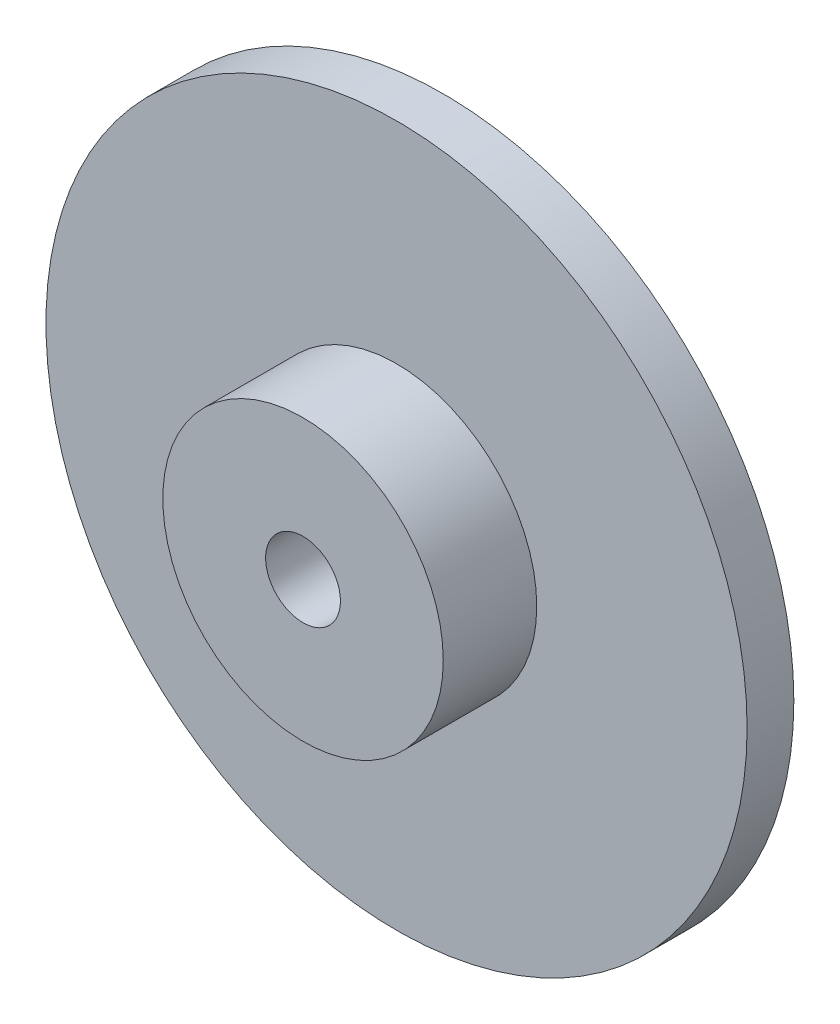
ISO-10303-21;
HEADER;
FILE_DESCRIPTION(('STEP AP214'),'2;1');
FILE_NAME('part.step','',(''),(''),'','','');
FILE_SCHEMA(('AUTOMOTIVE_DESIGN { 1 0 10303 214 1 1 1 1 }'));
ENDSEC;
DATA;
#1=APPLICATION_CONTEXT('core data for automotive mechanical design processes');
#2=APPLICATION_PROTOCOL_DEFINITION('international standard','automotive_design',2000,#1);
#3=PRODUCT_CONTEXT('',#1,'mechanical');
#4=PRODUCT('Part','Part','',(#3));
#5=PRODUCT_RELATED_PRODUCT_CATEGORY('part','',(#4));
#6=PRODUCT_DEFINITION_FORMATION('','',#4);
#7=PRODUCT_DEFINITION_CONTEXT('part definition',#1,'design');
#8=PRODUCT_DEFINITION('design','',#6,#7);
#9=PRODUCT_DEFINITION_SHAPE('','',#8);
#10=(LENGTH_UNIT() NAMED_UNIT(*) SI_UNIT(.MILLI.,.METRE.));
#11=(NAMED_UNIT(*) PLANE_ANGLE_UNIT() SI_UNIT($,.RADIAN.));
#12=(NAMED_UNIT(*) SI_UNIT($,.STERADIAN.) SOLID_ANGLE_UNIT());
#13=UNCERTAINTY_MEASURE_WITH_UNIT(LENGTH_MEASURE(1.E-05),#10,'distance_accuracy_value','');
#14=(GEOMETRIC_REPRESENTATION_CONTEXT(3) GLOBAL_UNCERTAINTY_ASSIGNED_CONTEXT((#13)) GLOBAL_UNIT_ASSIGNED_CONTEXT((#10,
#11,#12)) REPRESENTATION_CONTEXT('',''));
#15=CARTESIAN_POINT('',(0.,0.,0.));
#16=DIRECTION('',(0.,0.,1.));
#17=DIRECTION('',(1.,0.,0.));
#18=AXIS2_PLACEMENT_3D('',#15,#16,#17);
#19=CARTESIAN_POINT('',(0.,0.,0.));
#20=DIRECTION('',(0.,0.,1.));
#21=DIRECTION('',(1.,0.,0.));
#22=AXIS2_PLACEMENT_3D('',#19,#20,#21);
#23=CYLINDRICAL_SURFACE('',#22,8.);
#24=CARTESIAN_POINT('',(0.,0.,30.));
#25=DIRECTION('',(0.,0.,1.));
#26=DIRECTION('',(1.,0.,0.));
#27=AXIS2_PLACEMENT_3D('',#24,#25,#26);
#28=CIRCLE('',#27,8.);
#29=CARTESIAN_POINT('',(8.,0.,30.));
#30=VERTEX_POINT('',#29);
#31=EDGE_CURVE('E124',#30,#30,#28,.T.);
#32=ORIENTED_EDGE('',*,*,#31,.T.);
#33=EDGE_LOOP('',(#32));
#34=FACE_BOUND('',#33,.T.);
#35=CARTESIAN_POINT('',(0.,0.,0.));
#36=DIRECTION('',(0.,0.,1.));
#37=DIRECTION('',(1.,0.,0.));
#38=AXIS2_PLACEMENT_3D('',#35,#36,#37);
#39=CIRCLE('',#38,8.);
#40=CARTESIAN_POINT('',(8.,0.,0.));
#41=VERTEX_POINT('',#40);
#42=EDGE_CURVE('E126',#41,#41,#39,.T.);
#43=ORIENTED_EDGE('',*,*,#42,.F.);
#44=EDGE_LOOP('',(#43));
#45=FACE_BOUND('',#44,.T.);
#46=CARTESIAN_POINT('',(0.,0.,5.));
#47=DIRECTION('',(0.,0.,1.));
#48=DIRECTION('',(1.,0.,0.));
#49=AXIS2_PLACEMENT_3D('',#46,#47,#48);
#50=CIRCLE('',#49,8.);
#51=CARTESIAN_POINT('',(-2.5,7.59934207678533,5.));
#52=VERTEX_POINT('',#51);
#53=CARTESIAN_POINT('',(2.5,7.59934207678533,5.));
#54=VERTEX_POINT('',#53);
#55=EDGE_CURVE('E11',#52,#54,#50,.F.);
#56=ORIENTED_EDGE('',*,*,#55,.F.);
#57=DIRECTION('',(0.,0.,1.));
#58=VECTOR('',#57,1.);
#59=CARTESIAN_POINT('',(-2.5,7.59934207678533,0.));
#60=LINE('',#59,#58);
#61=CARTESIAN_POINT('',(-2.5,7.59934207678533,25.));
#62=VERTEX_POINT('',#61);
#63=EDGE_CURVE('E71',#52,#62,#60,.T.);
#64=ORIENTED_EDGE('',*,*,#63,.T.);
#65=CARTESIAN_POINT('',(0.,0.,25.));
#66=DIRECTION('',(0.,0.,1.));
#67=DIRECTION('',(1.,0.,0.));
#68=AXIS2_PLACEMENT_3D('',#65,#66,#67);
#69=CIRCLE('',#68,8.);
#70=CARTESIAN_POINT('',(2.5,7.59934207678533,25.));
#71=VERTEX_POINT('',#70);
#72=EDGE_CURVE('E142',#62,#71,#69,.F.);
#73=ORIENTED_EDGE('',*,*,#72,.T.);
#74=DIRECTION('',(0.,0.,1.));
#75=VECTOR('',#74,1.);
#76=CARTESIAN_POINT('',(2.5,7.59934207678533,0.));
#77=LINE('',#76,#75);
#78=EDGE_CURVE('E56',#71,#54,#77,.F.);
#79=ORIENTED_EDGE('',*,*,#78,.T.);
#80=EDGE_LOOP('',(#56,#64,#73,#79));
#81=FACE_BOUND('',#80,.T.);
#82=ADVANCED_FACE('F47',(#34,#45,#81),#23,.F.);
#83=CARTESIAN_POINT('',(0.,0.,10.));
#84=DIRECTION('',(0.,0.,-1.));
#85=DIRECTION('',(-1.,0.,0.));
#86=AXIS2_PLACEMENT_3D('',#83,#84,#85);
#87=CYLINDRICAL_SURFACE('',#86,75.);
#88=CARTESIAN_POINT('',(0.,0.,10.));
#89=DIRECTION('',(0.,0.,1.));
#90=DIRECTION('',(1.,0.,0.));
#91=AXIS2_PLACEMENT_3D('',#88,#89,#90);
#92=CIRCLE('',#91,75.);
#93=CARTESIAN_POINT('',(75.,0.,10.));
#94=VERTEX_POINT('',#93);
#95=EDGE_CURVE('E143',#94,#94,#92,.T.);
#96=ORIENTED_EDGE('',*,*,#95,.F.);
#97=EDGE_LOOP('',(#96));
#98=FACE_BOUND('',#97,.T.);
#99=CARTESIAN_POINT('',(0.,0.,0.));
#100=DIRECTION('',(0.,0.,1.));
#101=DIRECTION('',(1.,0.,0.));
#102=AXIS2_PLACEMENT_3D('',#99,#100,#101);
#103=CIRCLE('',#102,75.);
#104=CARTESIAN_POINT('',(75.,0.,0.));
#105=VERTEX_POINT('',#104);
#106=EDGE_CURVE('E137',#105,#105,#103,.T.);
#107=ORIENTED_EDGE('',*,*,#106,.T.);
#108=EDGE_LOOP('',(#107));
#109=FACE_BOUND('',#108,.T.);
#110=ADVANCED_FACE('F49',(#98,#109),#87,.T.);
#111=CARTESIAN_POINT('',(0.,0.,10.));
#112=DIRECTION('',(0.,0.,1.));
#113=DIRECTION('',(1.,0.,0.));
#114=AXIS2_PLACEMENT_3D('',#111,#112,#113);
#115=PLANE('',#114);
#116=CARTESIAN_POINT('',(0.,0.,10.));
#117=DIRECTION('',(0.,0.,1.));
#118=DIRECTION('',(1.,0.,0.));
#119=AXIS2_PLACEMENT_3D('',#116,#117,#118);
#120=CIRCLE('',#119,30.);
#121=CARTESIAN_POINT('',(30.,0.,10.));
#122=VERTEX_POINT('',#121);
#123=EDGE_CURVE('E138',#122,#122,#120,.T.);
#124=ORIENTED_EDGE('',*,*,#123,.F.);
#125=EDGE_LOOP('',(#124));
#126=FACE_BOUND('',#125,.T.);
#127=ORIENTED_EDGE('',*,*,#95,.T.);
#128=EDGE_LOOP('',(#127));
#129=FACE_BOUND('',#128,.T.);
#130=ADVANCED_FACE('F176',(#126,#129),#115,.T.);
#131=CARTESIAN_POINT('',(0.,0.,0.));
#132=DIRECTION('',(0.,0.,1.));
#133=DIRECTION('',(1.,0.,0.));
#134=AXIS2_PLACEMENT_3D('',#131,#132,#133);
#135=PLANE('',#134);
#136=ORIENTED_EDGE('',*,*,#42,.T.);
#137=EDGE_LOOP('',(#136));
#138=FACE_BOUND('',#137,.T.);
#139=ORIENTED_EDGE('',*,*,#106,.F.);
#140=EDGE_LOOP('',(#139));
#141=FACE_BOUND('',#140,.T.);
#142=ADVANCED_FACE('F186',(#138,#141),#135,.F.);
#143=CARTESIAN_POINT('',(0.,0.,30.));
#144=DIRECTION('',(0.,0.,-1.));
#145=DIRECTION('',(-1.,0.,0.));
#146=AXIS2_PLACEMENT_3D('',#143,#144,#145);
#147=CYLINDRICAL_SURFACE('',#146,30.);
#148=CARTESIAN_POINT('',(0.,0.,30.));
#149=DIRECTION('',(0.,0.,1.));
#150=DIRECTION('',(1.,0.,0.));
#151=AXIS2_PLACEMENT_3D('',#148,#149,#150);
#152=CIRCLE('',#151,30.);
#153=CARTESIAN_POINT('',(30.,0.,30.));
#154=VERTEX_POINT('',#153);
#155=EDGE_CURVE('E130',#154,#154,#152,.T.);
#156=ORIENTED_EDGE('',*,*,#155,.F.);
#157=EDGE_LOOP('',(#156));
#158=FACE_BOUND('',#157,.T.);
#159=ORIENTED_EDGE('',*,*,#123,.T.);
#160=EDGE_LOOP('',(#159));
#161=FACE_BOUND('',#160,.T.);
#162=ADVANCED_FACE('F182',(#158,#161),#147,.T.);
#163=CARTESIAN_POINT('',(0.,0.,30.));
#164=DIRECTION('',(0.,0.,1.));
#165=DIRECTION('',(1.,0.,0.));
#166=AXIS2_PLACEMENT_3D('',#163,#164,#165);
#167=PLANE('',#166);
#168=ORIENTED_EDGE('',*,*,#31,.F.);
#169=EDGE_LOOP('',(#168));
#170=FACE_BOUND('',#169,.T.);
#171=ORIENTED_EDGE('',*,*,#155,.T.);
#172=EDGE_LOOP('',(#171));
#173=FACE_BOUND('',#172,.T.);
#174=ADVANCED_FACE('F166',(#170,#173),#167,.T.);
#175=CARTESIAN_POINT('',(2.5,11.,5.));
#176=DIRECTION('',(1.,0.,0.));
#177=DIRECTION('',(0.,0.,-1.));
#178=AXIS2_PLACEMENT_3D('',#175,#176,#177);
#179=PLANE('',#178);
#180=DIRECTION('',(0.,1.,0.));
#181=VECTOR('',#180,1.);
#182=CARTESIAN_POINT('',(2.5,11.,25.));
#183=LINE('',#182,#181);
#184=CARTESIAN_POINT('',(2.5,11.,25.));
#185=VERTEX_POINT('',#184);
#186=EDGE_CURVE('E63',#71,#185,#183,.T.);
#187=ORIENTED_EDGE('',*,*,#186,.T.);
#188=DIRECTION('',(0.,0.,1.));
#189=VECTOR('',#188,1.);
#190=CARTESIAN_POINT('',(2.5,11.,5.));
#191=LINE('',#190,#189);
#192=CARTESIAN_POINT('',(2.5,11.,5.));
#193=VERTEX_POINT('',#192);
#194=EDGE_CURVE('E102',#193,#185,#191,.T.);
#195=ORIENTED_EDGE('',*,*,#194,.F.);
#196=DIRECTION('',(0.,1.,0.));
#197=VECTOR('',#196,1.);
#198=CARTESIAN_POINT('',(2.5,11.,5.));
#199=LINE('',#198,#197);
#200=EDGE_CURVE('E90',#54,#193,#199,.T.);
#201=ORIENTED_EDGE('',*,*,#200,.F.);
#202=ORIENTED_EDGE('',*,*,#78,.F.);
#203=EDGE_LOOP('',(#187,#195,#201,#202));
#204=FACE_BOUND('',#203,.T.);
#205=ADVANCED_FACE('F103',(#204),#179,.F.);
#206=CARTESIAN_POINT('',(-2.5,11.,5.));
#207=DIRECTION('',(-1.,0.,0.));
#208=DIRECTION('',(0.,-1.,0.));
#209=AXIS2_PLACEMENT_3D('',#206,#207,#208);
#210=PLANE('',#209);
#211=DIRECTION('',(0.,-1.,0.));
#212=VECTOR('',#211,1.);
#213=CARTESIAN_POINT('',(-2.5,11.,5.));
#214=LINE('',#213,#212);
#215=CARTESIAN_POINT('',(-2.5,11.,5.));
#216=VERTEX_POINT('',#215);
#217=EDGE_CURVE('E108',#216,#52,#214,.T.);
#218=ORIENTED_EDGE('',*,*,#217,.F.);
#219=DIRECTION('',(0.,0.,1.));
#220=VECTOR('',#219,1.);
#221=CARTESIAN_POINT('',(-2.5,11.,5.));
#222=LINE('',#221,#220);
#223=CARTESIAN_POINT('',(-2.5,11.,25.));
#224=VERTEX_POINT('',#223);
#225=EDGE_CURVE('E107',#216,#224,#222,.T.);
#226=ORIENTED_EDGE('',*,*,#225,.T.);
#227=DIRECTION('',(0.,-1.,0.));
#228=VECTOR('',#227,1.);
#229=CARTESIAN_POINT('',(-2.5,11.,25.));
#230=LINE('',#229,#228);
#231=EDGE_CURVE('E99',#224,#62,#230,.T.);
#232=ORIENTED_EDGE('',*,*,#231,.T.);
#233=ORIENTED_EDGE('',*,*,#63,.F.);
#234=EDGE_LOOP('',(#218,#226,#232,#233));
#235=FACE_BOUND('',#234,.T.);
#236=ADVANCED_FACE('F158',(#235),#210,.F.);
#237=CARTESIAN_POINT('',(0.,0.,5.));
#238=DIRECTION('',(0.,0.,1.));
#239=DIRECTION('',(1.,0.,0.));
#240=AXIS2_PLACEMENT_3D('',#237,#238,#239);
#241=PLANE('',#240);
#242=ORIENTED_EDGE('',*,*,#55,.T.);
#243=ORIENTED_EDGE('',*,*,#200,.T.);
#244=DIRECTION('',(-1.,0.,0.));
#245=VECTOR('',#244,1.);
#246=CARTESIAN_POINT('',(-2.5,11.,5.));
#247=LINE('',#246,#245);
#248=EDGE_CURVE('E94',#193,#216,#247,.T.);
#249=ORIENTED_EDGE('',*,*,#248,.T.);
#250=ORIENTED_EDGE('',*,*,#217,.T.);
#251=EDGE_LOOP('',(#242,#243,#249,#250));
#252=FACE_BOUND('',#251,.T.);
#253=ADVANCED_FACE('F92',(#252),#241,.T.);
#254=CARTESIAN_POINT('',(0.,0.,25.));
#255=DIRECTION('',(0.,0.,1.));
#256=DIRECTION('',(1.,0.,0.));
#257=AXIS2_PLACEMENT_3D('',#254,#255,#256);
#258=PLANE('',#257);
#259=ORIENTED_EDGE('',*,*,#231,.F.);
#260=DIRECTION('',(-1.,0.,0.));
#261=VECTOR('',#260,1.);
#262=CARTESIAN_POINT('',(-2.5,11.,25.));
#263=LINE('',#262,#261);
#264=EDGE_CURVE('E118',#185,#224,#263,.T.);
#265=ORIENTED_EDGE('',*,*,#264,.F.);
#266=ORIENTED_EDGE('',*,*,#186,.F.);
#267=ORIENTED_EDGE('',*,*,#72,.F.);
#268=EDGE_LOOP('',(#259,#265,#266,#267));
#269=FACE_BOUND('',#268,.T.);
#270=ADVANCED_FACE('F157',(#269),#258,.F.);
#271=CARTESIAN_POINT('',(-2.5,11.,5.));
#272=DIRECTION('',(0.,1.,0.));
#273=DIRECTION('',(0.,0.,1.));
#274=AXIS2_PLACEMENT_3D('',#271,#272,#273);
#275=PLANE('',#274);
#276=ORIENTED_EDGE('',*,*,#264,.T.);
#277=ORIENTED_EDGE('',*,*,#225,.F.);
#278=ORIENTED_EDGE('',*,*,#248,.F.);
#279=ORIENTED_EDGE('',*,*,#194,.T.);
#280=EDGE_LOOP('',(#276,#277,#278,#279));
#281=FACE_BOUND('',#280,.T.);
#282=ADVANCED_FACE('F110',(#281),#275,.F.);
#283=CLOSED_SHELL('',(#82,#110,#130,#142,#162,#174,#205,#236,#253,#270,#282));
#284=MANIFOLD_SOLID_BREP('B2',#283);
#285=ADVANCED_BREP_SHAPE_REPRESENTATION('',(#18,#284),#14);
#286=SHAPE_DEFINITION_REPRESENTATION(#9,#285);
ENDSEC;
END-ISO-10303-21;
